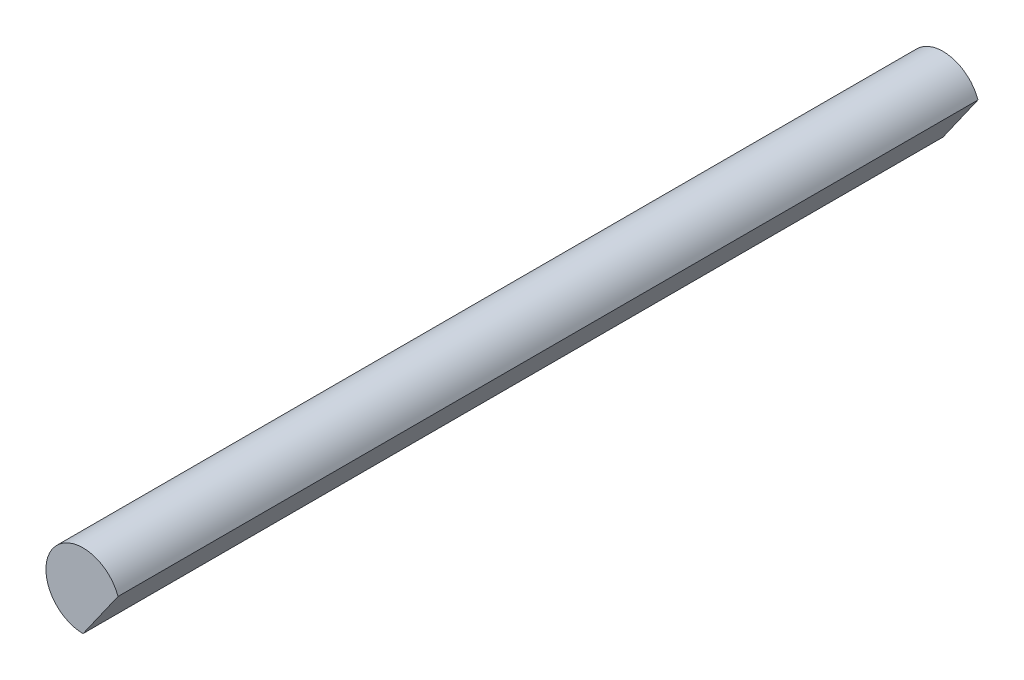
ISO-10303-21;
HEADER;
FILE_DESCRIPTION(('STEP AP214'),'2;1');
FILE_NAME('part.step','',(''),(''),'','','');
FILE_SCHEMA(('AUTOMOTIVE_DESIGN { 1 0 10303 214 1 1 1 1 }'));
ENDSEC;
DATA;
#1=APPLICATION_CONTEXT('core data for automotive mechanical design processes');
#2=APPLICATION_PROTOCOL_DEFINITION('international standard','automotive_design',2000,#1);
#3=PRODUCT_CONTEXT('',#1,'mechanical');
#4=PRODUCT('Part','Part','',(#3));
#5=PRODUCT_RELATED_PRODUCT_CATEGORY('part','',(#4));
#6=PRODUCT_DEFINITION_FORMATION('','',#4);
#7=PRODUCT_DEFINITION_CONTEXT('part definition',#1,'design');
#8=PRODUCT_DEFINITION('design','',#6,#7);
#9=PRODUCT_DEFINITION_SHAPE('','',#8);
#10=(LENGTH_UNIT() NAMED_UNIT(*) SI_UNIT(.MILLI.,.METRE.));
#11=(NAMED_UNIT(*) PLANE_ANGLE_UNIT() SI_UNIT($,.RADIAN.));
#12=(NAMED_UNIT(*) SI_UNIT($,.STERADIAN.) SOLID_ANGLE_UNIT());
#13=UNCERTAINTY_MEASURE_WITH_UNIT(LENGTH_MEASURE(1.E-05),#10,'distance_accuracy_value','');
#14=(GEOMETRIC_REPRESENTATION_CONTEXT(3) GLOBAL_UNCERTAINTY_ASSIGNED_CONTEXT((#13)) GLOBAL_UNIT_ASSIGNED_CONTEXT((#10,
#11,#12)) REPRESENTATION_CONTEXT('',''));
#15=CARTESIAN_POINT('',(0.,0.,0.));
#16=DIRECTION('',(0.,0.,1.));
#17=DIRECTION('',(1.,0.,0.));
#18=AXIS2_PLACEMENT_3D('',#15,#16,#17);
#19=CARTESIAN_POINT('',(0.,0.,38.920801313614));
#20=DIRECTION('',(0.,0.,-1.));
#21=DIRECTION('',(-1.,0.,0.));
#22=AXIS2_PLACEMENT_3D('',#19,#20,#21);
#23=CYLINDRICAL_SURFACE('',#22,1.5);
#24=CARTESIAN_POINT('',(0.,0.,34.74));
#25=DIRECTION('',(0.,0.,1.));
#26=DIRECTION('',(1.,0.,0.));
#27=AXIS2_PLACEMENT_3D('',#24,#25,#26);
#28=CIRCLE('',#27,1.5);
#29=CARTESIAN_POINT('',(1.41189035148846,0.506523084739268,34.74));
#30=VERTEX_POINT('',#29);
#31=CARTESIAN_POINT('',(-0.00170223000694743,-1.49999903413736,34.74));
#32=VERTEX_POINT('',#31);
#33=EDGE_CURVE('E11',#30,#32,#28,.T.);
#34=ORIENTED_EDGE('',*,*,#33,.F.);
#35=DIRECTION('',(0.,0.,-1.));
#36=VECTOR('',#35,1.);
#37=CARTESIAN_POINT('',(1.41189035148846,0.506523084739268,38.920801313614));
#38=LINE('',#37,#36);
#39=CARTESIAN_POINT('',(1.41189035148846,0.506523084739268,0.));
#40=VERTEX_POINT('',#39);
#41=EDGE_CURVE('E38',#30,#40,#38,.T.);
#42=ORIENTED_EDGE('',*,*,#41,.T.);
#43=CARTESIAN_POINT('',(0.,0.,0.));
#44=DIRECTION('',(0.,0.,1.));
#45=DIRECTION('',(1.,0.,0.));
#46=AXIS2_PLACEMENT_3D('',#43,#44,#45);
#47=CIRCLE('',#46,1.5);
#48=CARTESIAN_POINT('',(-0.00170223000694743,-1.49999903413736,0.));
#49=VERTEX_POINT('',#48);
#50=EDGE_CURVE('E63',#40,#49,#47,.T.);
#51=ORIENTED_EDGE('',*,*,#50,.T.);
#52=DIRECTION('',(0.,0.,-1.));
#53=VECTOR('',#52,1.);
#54=CARTESIAN_POINT('',(-0.00170223000694743,-1.49999903413736,38.920801313614));
#55=LINE('',#54,#53);
#56=EDGE_CURVE('E55',#32,#49,#55,.T.);
#57=ORIENTED_EDGE('',*,*,#56,.F.);
#58=EDGE_LOOP('',(#34,#42,#51,#57));
#59=FACE_BOUND('',#58,.T.);
#60=ADVANCED_FACE('F34',(#59),#23,.T.);
#61=CARTESIAN_POINT('',(-0.00170223000694743,-1.49999903413736,38.920801313614));
#62=DIRECTION('',(-0.81750036027914,0.575928086607588,0.));
#63=DIRECTION('',(-0.575928086607588,-0.81750036027914,0.));
#64=AXIS2_PLACEMENT_3D('',#61,#62,#63);
#65=PLANE('',#64);
#66=DIRECTION('',(0.575928086607588,0.81750036027914,0.));
#67=VECTOR('',#66,1.);
#68=CARTESIAN_POINT('',(-0.00170223000694743,-1.49999903413736,34.74));
#69=LINE('',#68,#67);
#70=EDGE_CURVE('E43',#32,#30,#69,.T.);
#71=ORIENTED_EDGE('',*,*,#70,.F.);
#72=ORIENTED_EDGE('',*,*,#56,.T.);
#73=DIRECTION('',(0.575928086607588,0.81750036027914,0.));
#74=VECTOR('',#73,1.);
#75=CARTESIAN_POINT('',(-0.00170223000694743,-1.49999903413736,0.));
#76=LINE('',#75,#74);
#77=EDGE_CURVE('E65',#49,#40,#76,.T.);
#78=ORIENTED_EDGE('',*,*,#77,.T.);
#79=ORIENTED_EDGE('',*,*,#41,.F.);
#80=EDGE_LOOP('',(#71,#72,#78,#79));
#81=FACE_BOUND('',#80,.T.);
#82=ADVANCED_FACE('F66',(#81),#65,.F.);
#83=CARTESIAN_POINT('',(0.,0.,0.));
#84=DIRECTION('',(0.,0.,1.));
#85=DIRECTION('',(1.,0.,0.));
#86=AXIS2_PLACEMENT_3D('',#83,#84,#85);
#87=PLANE('',#86);
#88=ORIENTED_EDGE('',*,*,#50,.F.);
#89=ORIENTED_EDGE('',*,*,#77,.F.);
#90=EDGE_LOOP('',(#88,#89));
#91=FACE_BOUND('',#90,.T.);
#92=ADVANCED_FACE('F69',(#91),#87,.F.);
#93=CARTESIAN_POINT('',(0.,0.,34.74));
#94=DIRECTION('',(0.,0.,1.));
#95=DIRECTION('',(-0.81750036027914,0.575928086607587,0.));
#96=AXIS2_PLACEMENT_3D('',#93,#94,#95);
#97=PLANE('',#96);
#98=ORIENTED_EDGE('',*,*,#70,.T.);
#99=ORIENTED_EDGE('',*,*,#33,.T.);
#100=EDGE_LOOP('',(#98,#99));
#101=FACE_BOUND('',#100,.T.);
#102=ADVANCED_FACE('F36',(#101),#97,.T.);
#103=CLOSED_SHELL('',(#60,#82,#92,#102));
#104=MANIFOLD_SOLID_BREP('B2',#103);
#105=ADVANCED_BREP_SHAPE_REPRESENTATION('',(#18,#104),#14);
#106=SHAPE_DEFINITION_REPRESENTATION(#9,#105);
ENDSEC;
END-ISO-10303-21;
